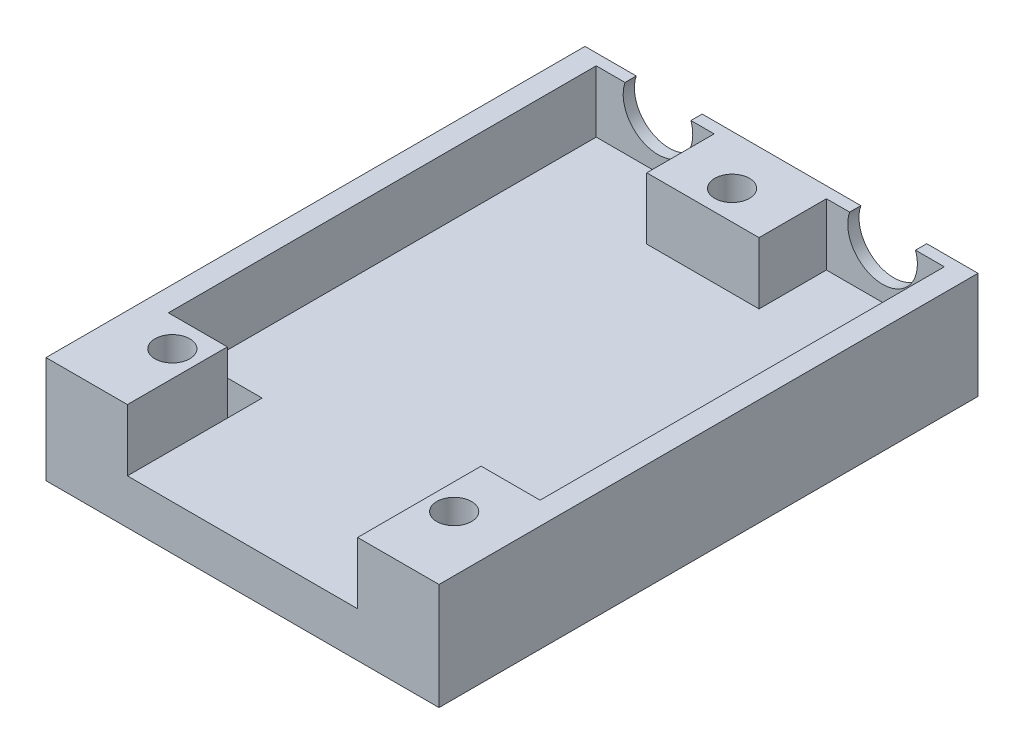
ISO-10303-21;
HEADER;
FILE_DESCRIPTION(('STEP AP214'),'2;1');
FILE_NAME('part.step','',(''),(''),'','','');
FILE_SCHEMA(('AUTOMOTIVE_DESIGN { 1 0 10303 214 1 1 1 1 }'));
ENDSEC;
DATA;
#1=APPLICATION_CONTEXT('core data for automotive mechanical design processes');
#2=APPLICATION_PROTOCOL_DEFINITION('international standard','automotive_design',2000,#1);
#3=PRODUCT_CONTEXT('',#1,'mechanical');
#4=PRODUCT('Part','Part','',(#3));
#5=PRODUCT_RELATED_PRODUCT_CATEGORY('part','',(#4));
#6=PRODUCT_DEFINITION_FORMATION('','',#4);
#7=PRODUCT_DEFINITION_CONTEXT('part definition',#1,'design');
#8=PRODUCT_DEFINITION('design','',#6,#7);
#9=PRODUCT_DEFINITION_SHAPE('','',#8);
#10=(LENGTH_UNIT() NAMED_UNIT(*) SI_UNIT(.MILLI.,.METRE.));
#11=(NAMED_UNIT(*) PLANE_ANGLE_UNIT() SI_UNIT($,.RADIAN.));
#12=(NAMED_UNIT(*) SI_UNIT($,.STERADIAN.) SOLID_ANGLE_UNIT());
#13=UNCERTAINTY_MEASURE_WITH_UNIT(LENGTH_MEASURE(1.E-05),#10,'distance_accuracy_value','');
#14=(GEOMETRIC_REPRESENTATION_CONTEXT(3) GLOBAL_UNCERTAINTY_ASSIGNED_CONTEXT((#13)) GLOBAL_UNIT_ASSIGNED_CONTEXT((#10,
#11,#12)) REPRESENTATION_CONTEXT('',''));
#15=CARTESIAN_POINT('',(0.,0.,0.));
#16=DIRECTION('',(0.,0.,1.));
#17=DIRECTION('',(1.,0.,0.));
#18=AXIS2_PLACEMENT_3D('',#15,#16,#17);
#19=CARTESIAN_POINT('',(0.,9.5,-23.));
#20=DIRECTION('',(0.,0.,-1.));
#21=DIRECTION('',(-1.,0.,0.));
#22=AXIS2_PLACEMENT_3D('',#19,#20,#21);
#23=PLANE('',#22);
#24=CARTESIAN_POINT('',(-10.,8.5,-23.));
#25=DIRECTION('',(0.,0.,-1.));
#26=DIRECTION('',(-1.,0.,0.));
#27=AXIS2_PLACEMENT_3D('',#24,#25,#26);
#28=CIRCLE('',#27,3.1);
#29=CARTESIAN_POINT('',(-12.9342801502242,9.5,-23.));
#30=VERTEX_POINT('',#29);
#31=CARTESIAN_POINT('',(-7.06571984977576,9.5,-23.));
#32=VERTEX_POINT('',#31);
#33=EDGE_CURVE('E355',#30,#32,#28,.F.);
#34=ORIENTED_EDGE('',*,*,#33,.F.);
#35=DIRECTION('',(1.,0.,0.));
#36=VECTOR('',#35,1.);
#37=CARTESIAN_POINT('',(0.,9.5,-23.));
#38=LINE('',#37,#36);
#39=CARTESIAN_POINT('',(-15.5,9.5,-23.));
#40=VERTEX_POINT('',#39);
#41=EDGE_CURVE('E432',#40,#30,#38,.T.);
#42=ORIENTED_EDGE('',*,*,#41,.F.);
#43=DIRECTION('',(0.,-1.,0.));
#44=VECTOR('',#43,1.);
#45=CARTESIAN_POINT('',(-15.5,9.5,-23.));
#46=LINE('',#45,#44);
#47=CARTESIAN_POINT('',(-15.5,4.,-23.));
#48=VERTEX_POINT('',#47);
#49=EDGE_CURVE('E442',#40,#48,#46,.T.);
#50=ORIENTED_EDGE('',*,*,#49,.T.);
#51=DIRECTION('',(1.,0.,0.));
#52=VECTOR('',#51,1.);
#53=CARTESIAN_POINT('',(0.,4.,-23.));
#54=LINE('',#53,#52);
#55=CARTESIAN_POINT('',(-4.99999999999998,4.,-23.));
#56=VERTEX_POINT('',#55);
#57=EDGE_CURVE('E443',#48,#56,#54,.T.);
#58=ORIENTED_EDGE('',*,*,#57,.T.);
#59=DIRECTION('',(0.,-1.,0.));
#60=VECTOR('',#59,1.);
#61=CARTESIAN_POINT('',(-4.99999999999998,9.5,-23.));
#62=LINE('',#61,#60);
#63=CARTESIAN_POINT('',(-4.99999999999998,9.5,-23.));
#64=VERTEX_POINT('',#63);
#65=EDGE_CURVE('E400',#64,#56,#62,.T.);
#66=ORIENTED_EDGE('',*,*,#65,.F.);
#67=EDGE_CURVE('E436',#32,#64,#38,.T.);
#68=ORIENTED_EDGE('',*,*,#67,.F.);
#69=EDGE_LOOP('',(#34,#42,#50,#58,#66,#68));
#70=FACE_BOUND('',#69,.T.);
#71=ADVANCED_FACE('F37',(#70),#23,.F.);
#72=CARTESIAN_POINT('',(10.,8.5,-23.));
#73=DIRECTION('',(0.,0.,-1.));
#74=DIRECTION('',(-1.,0.,0.));
#75=AXIS2_PLACEMENT_3D('',#72,#73,#74);
#76=CIRCLE('',#75,3.1);
#77=CARTESIAN_POINT('',(7.06571984977576,9.5,-23.));
#78=VERTEX_POINT('',#77);
#79=CARTESIAN_POINT('',(12.9342801502242,9.5,-23.));
#80=VERTEX_POINT('',#79);
#81=EDGE_CURVE('E359',#78,#80,#76,.F.);
#82=ORIENTED_EDGE('',*,*,#81,.F.);
#83=CARTESIAN_POINT('',(5.00000000000002,9.5,-23.));
#84=VERTEX_POINT('',#83);
#85=EDGE_CURVE('E437',#84,#78,#38,.T.);
#86=ORIENTED_EDGE('',*,*,#85,.F.);
#87=DIRECTION('',(0.,-1.,0.));
#88=VECTOR('',#87,1.);
#89=CARTESIAN_POINT('',(5.00000000000002,9.5,-23.));
#90=LINE('',#89,#88);
#91=CARTESIAN_POINT('',(5.00000000000002,4.,-23.));
#92=VERTEX_POINT('',#91);
#93=EDGE_CURVE('E408',#84,#92,#90,.T.);
#94=ORIENTED_EDGE('',*,*,#93,.T.);
#95=CARTESIAN_POINT('',(15.5,4.,-23.));
#96=VERTEX_POINT('',#95);
#97=EDGE_CURVE('E415',#92,#96,#54,.T.);
#98=ORIENTED_EDGE('',*,*,#97,.T.);
#99=DIRECTION('',(0.,-1.,0.));
#100=VECTOR('',#99,1.);
#101=CARTESIAN_POINT('',(15.5,9.5,-23.));
#102=LINE('',#101,#100);
#103=CARTESIAN_POINT('',(15.5,9.5,-23.));
#104=VERTEX_POINT('',#103);
#105=EDGE_CURVE('E454',#104,#96,#102,.T.);
#106=ORIENTED_EDGE('',*,*,#105,.F.);
#107=EDGE_CURVE('E431',#80,#104,#38,.T.);
#108=ORIENTED_EDGE('',*,*,#107,.F.);
#109=EDGE_LOOP('',(#82,#86,#94,#98,#106,#108));
#110=FACE_BOUND('',#109,.T.);
#111=ADVANCED_FACE('F582',(#110),#23,.F.);
#112=CARTESIAN_POINT('',(-17.5,4.,-24.));
#113=DIRECTION('',(0.,0.,1.));
#114=DIRECTION('',(1.,0.,0.));
#115=AXIS2_PLACEMENT_3D('',#112,#113,#114);
#116=PLANE('',#115);
#117=CARTESIAN_POINT('',(10.,8.5,-24.));
#118=DIRECTION('',(0.,0.,-1.));
#119=DIRECTION('',(-1.,0.,0.));
#120=AXIS2_PLACEMENT_3D('',#117,#118,#119);
#121=CIRCLE('',#120,3.1);
#122=CARTESIAN_POINT('',(7.06571984977576,9.5,-24.));
#123=VERTEX_POINT('',#122);
#124=CARTESIAN_POINT('',(12.9342801502242,9.5,-24.));
#125=VERTEX_POINT('',#124);
#126=EDGE_CURVE('E352',#123,#125,#121,.F.);
#127=ORIENTED_EDGE('',*,*,#126,.T.);
#128=DIRECTION('',(-1.,0.,0.));
#129=VECTOR('',#128,1.);
#130=CARTESIAN_POINT('',(0.,9.5,-24.));
#131=LINE('',#130,#129);
#132=CARTESIAN_POINT('',(17.5,9.5,-24.));
#133=VERTEX_POINT('',#132);
#134=EDGE_CURVE('E416',#133,#125,#131,.T.);
#135=ORIENTED_EDGE('',*,*,#134,.F.);
#136=DIRECTION('',(0.,-1.,0.));
#137=VECTOR('',#136,1.);
#138=CARTESIAN_POINT('',(17.5,4.,-24.));
#139=LINE('',#138,#137);
#140=CARTESIAN_POINT('',(17.5,0.,-24.));
#141=VERTEX_POINT('',#140);
#142=EDGE_CURVE('E469',#133,#141,#139,.T.);
#143=ORIENTED_EDGE('',*,*,#142,.T.);
#144=DIRECTION('',(-1.,0.,0.));
#145=VECTOR('',#144,1.);
#146=CARTESIAN_POINT('',(-17.5,0.,-24.));
#147=LINE('',#146,#145);
#148=CARTESIAN_POINT('',(-17.5,0.,-24.));
#149=VERTEX_POINT('',#148);
#150=EDGE_CURVE('E464',#141,#149,#147,.T.);
#151=ORIENTED_EDGE('',*,*,#150,.T.);
#152=DIRECTION('',(0.,-1.,0.));
#153=VECTOR('',#152,1.);
#154=CARTESIAN_POINT('',(-17.5,4.,-24.));
#155=LINE('',#154,#153);
#156=CARTESIAN_POINT('',(-17.5,9.5,-24.));
#157=VERTEX_POINT('',#156);
#158=EDGE_CURVE('E466',#157,#149,#155,.T.);
#159=ORIENTED_EDGE('',*,*,#158,.F.);
#160=CARTESIAN_POINT('',(-12.9342801502242,9.5,-24.));
#161=VERTEX_POINT('',#160);
#162=EDGE_CURVE('E421',#161,#157,#131,.T.);
#163=ORIENTED_EDGE('',*,*,#162,.F.);
#164=CARTESIAN_POINT('',(-10.,8.5,-24.));
#165=DIRECTION('',(0.,0.,-1.));
#166=DIRECTION('',(-1.,0.,0.));
#167=AXIS2_PLACEMENT_3D('',#164,#165,#166);
#168=CIRCLE('',#167,3.1);
#169=CARTESIAN_POINT('',(-7.06571984977576,9.5,-24.));
#170=VERTEX_POINT('',#169);
#171=EDGE_CURVE('E351',#161,#170,#168,.F.);
#172=ORIENTED_EDGE('',*,*,#171,.T.);
#173=EDGE_CURVE('E420',#123,#170,#131,.T.);
#174=ORIENTED_EDGE('',*,*,#173,.F.);
#175=EDGE_LOOP('',(#127,#135,#143,#151,#159,#163,#172,#174));
#176=FACE_BOUND('',#175,.T.);
#177=ADVANCED_FACE('F493',(#176),#116,.F.);
#178=CARTESIAN_POINT('',(0.,9.5,0.));
#179=DIRECTION('',(0.,1.,0.));
#180=DIRECTION('',(0.,0.,1.));
#181=AXIS2_PLACEMENT_3D('',#178,#179,#180);
#182=PLANE('',#181);
#183=CARTESIAN_POINT('',(12.55,9.5,17.7));
#184=DIRECTION('',(0.,1.,0.));
#185=DIRECTION('',(0.,0.,1.));
#186=AXIS2_PLACEMENT_3D('',#183,#184,#185);
#187=CIRCLE('',#186,1.55);
#188=CARTESIAN_POINT('',(12.55,9.5,19.25));
#189=VERTEX_POINT('',#188);
#190=EDGE_CURVE('E316',#189,#189,#187,.T.);
#191=ORIENTED_EDGE('',*,*,#190,.F.);
#192=EDGE_LOOP('',(#191));
#193=FACE_BOUND('',#192,.T.);
#194=ORIENTED_EDGE('',*,*,#134,.T.);
#195=DIRECTION('',(0.,0.,-1.));
#196=VECTOR('',#195,1.);
#197=CARTESIAN_POINT('',(12.9342801502242,9.5,-22.));
#198=LINE('',#197,#196);
#199=EDGE_CURVE('E11',#125,#80,#198,.F.);
#200=ORIENTED_EDGE('',*,*,#199,.T.);
#201=ORIENTED_EDGE('',*,*,#107,.T.);
#202=DIRECTION('',(0.,0.,1.));
#203=VECTOR('',#202,1.);
#204=CARTESIAN_POINT('',(15.5,9.5,0.));
#205=LINE('',#204,#203);
#206=CARTESIAN_POINT('',(15.5,9.5,13.));
#207=VERTEX_POINT('',#206);
#208=EDGE_CURVE('E435',#104,#207,#205,.T.);
#209=ORIENTED_EDGE('',*,*,#208,.T.);
#210=DIRECTION('',(-1.,0.,0.));
#211=VECTOR('',#210,1.);
#212=CARTESIAN_POINT('',(15.5,9.5,13.));
#213=LINE('',#212,#211);
#214=CARTESIAN_POINT('',(10.25,9.5,13.));
#215=VERTEX_POINT('',#214);
#216=EDGE_CURVE('E371',#207,#215,#213,.T.);
#217=ORIENTED_EDGE('',*,*,#216,.T.);
#218=DIRECTION('',(0.,0.,1.));
#219=VECTOR('',#218,1.);
#220=CARTESIAN_POINT('',(10.25,9.5,21.));
#221=LINE('',#220,#219);
#222=CARTESIAN_POINT('',(10.25,9.5,24.));
#223=VERTEX_POINT('',#222);
#224=EDGE_CURVE('E373',#215,#223,#221,.T.);
#225=ORIENTED_EDGE('',*,*,#224,.T.);
#226=DIRECTION('',(1.,0.,0.));
#227=VECTOR('',#226,1.);
#228=CARTESIAN_POINT('',(0.,9.5,24.));
#229=LINE('',#228,#227);
#230=CARTESIAN_POINT('',(17.5,9.5,24.));
#231=VERTEX_POINT('',#230);
#232=EDGE_CURVE('E424',#223,#231,#229,.T.);
#233=ORIENTED_EDGE('',*,*,#232,.T.);
#234=DIRECTION('',(0.,0.,-1.));
#235=VECTOR('',#234,1.);
#236=CARTESIAN_POINT('',(17.5,9.5,0.));
#237=LINE('',#236,#235);
#238=EDGE_CURVE('E428',#231,#133,#237,.T.);
#239=ORIENTED_EDGE('',*,*,#238,.T.);
#240=EDGE_LOOP('',(#194,#200,#201,#209,#217,#225,#233,#239));
#241=FACE_BOUND('',#240,.T.);
#242=ADVANCED_FACE('F547',(#193,#241),#182,.T.);
#243=CARTESIAN_POINT('',(0.,9.5,-19.6));
#244=DIRECTION('',(0.,1.,0.));
#245=DIRECTION('',(0.,0.,1.));
#246=AXIS2_PLACEMENT_3D('',#243,#244,#245);
#247=CIRCLE('',#246,1.55);
#248=CARTESIAN_POINT('',(0.,9.5,-18.05));
#249=VERTEX_POINT('',#248);
#250=EDGE_CURVE('E273',#249,#249,#247,.T.);
#251=ORIENTED_EDGE('',*,*,#250,.F.);
#252=EDGE_LOOP('',(#251));
#253=FACE_BOUND('',#252,.T.);
#254=ORIENTED_EDGE('',*,*,#85,.T.);
#255=DIRECTION('',(0.,0.,-1.));
#256=VECTOR('',#255,1.);
#257=CARTESIAN_POINT('',(7.06571984977576,9.5,-22.));
#258=LINE('',#257,#256);
#259=EDGE_CURVE('E45',#78,#123,#258,.T.);
#260=ORIENTED_EDGE('',*,*,#259,.T.);
#261=ORIENTED_EDGE('',*,*,#173,.T.);
#262=DIRECTION('',(0.,0.,-1.));
#263=VECTOR('',#262,1.);
#264=CARTESIAN_POINT('',(-7.06571984977576,9.5,-22.));
#265=LINE('',#264,#263);
#266=EDGE_CURVE('E481',#170,#32,#265,.F.);
#267=ORIENTED_EDGE('',*,*,#266,.T.);
#268=ORIENTED_EDGE('',*,*,#67,.T.);
#269=DIRECTION('',(0.,0.,1.));
#270=VECTOR('',#269,1.);
#271=CARTESIAN_POINT('',(-4.99999999999998,9.5,-23.));
#272=LINE('',#271,#270);
#273=CARTESIAN_POINT('',(-4.99999999999998,9.5,-17.));
#274=VERTEX_POINT('',#273);
#275=EDGE_CURVE('E392',#64,#274,#272,.T.);
#276=ORIENTED_EDGE('',*,*,#275,.T.);
#277=DIRECTION('',(1.,0.,0.));
#278=VECTOR('',#277,1.);
#279=CARTESIAN_POINT('',(-4.99999999999998,9.5,-17.));
#280=LINE('',#279,#278);
#281=CARTESIAN_POINT('',(5.00000000000002,9.5,-17.));
#282=VERTEX_POINT('',#281);
#283=EDGE_CURVE('E395',#274,#282,#280,.T.);
#284=ORIENTED_EDGE('',*,*,#283,.T.);
#285=DIRECTION('',(0.,0.,-1.));
#286=VECTOR('',#285,1.);
#287=CARTESIAN_POINT('',(5.00000000000002,9.5,-23.));
#288=LINE('',#287,#286);
#289=EDGE_CURVE('E398',#282,#84,#288,.T.);
#290=ORIENTED_EDGE('',*,*,#289,.T.);
#291=EDGE_LOOP('',(#254,#260,#261,#267,#268,#276,#284,#290));
#292=FACE_BOUND('',#291,.T.);
#293=ADVANCED_FACE('F488',(#253,#292),#182,.T.);
#294=CARTESIAN_POINT('',(-12.55,9.5,17.7));
#295=DIRECTION('',(0.,1.,0.));
#296=DIRECTION('',(0.,0.,1.));
#297=AXIS2_PLACEMENT_3D('',#294,#295,#296);
#298=CIRCLE('',#297,1.55);
#299=CARTESIAN_POINT('',(-12.55,9.5,19.25));
#300=VERTEX_POINT('',#299);
#301=EDGE_CURVE('E310',#300,#300,#298,.T.);
#302=ORIENTED_EDGE('',*,*,#301,.F.);
#303=EDGE_LOOP('',(#302));
#304=FACE_BOUND('',#303,.T.);
#305=DIRECTION('',(1.,0.,0.));
#306=VECTOR('',#305,1.);
#307=CARTESIAN_POINT('',(-15.5,9.5,15.1));
#308=LINE('',#307,#306);
#309=CARTESIAN_POINT('',(-15.5,9.5,15.1));
#310=VERTEX_POINT('',#309);
#311=CARTESIAN_POINT('',(-10.25,9.5,15.1));
#312=VERTEX_POINT('',#311);
#313=EDGE_CURVE('E309',#310,#312,#308,.T.);
#314=ORIENTED_EDGE('',*,*,#313,.F.);
#315=DIRECTION('',(0.,0.,1.));
#316=VECTOR('',#315,1.);
#317=CARTESIAN_POINT('',(-15.5,9.5,0.));
#318=LINE('',#317,#316);
#319=EDGE_CURVE('E440',#40,#310,#318,.T.);
#320=ORIENTED_EDGE('',*,*,#319,.F.);
#321=ORIENTED_EDGE('',*,*,#41,.T.);
#322=DIRECTION('',(0.,0.,-1.));
#323=VECTOR('',#322,1.);
#324=CARTESIAN_POINT('',(-12.9342801502242,9.5,-22.));
#325=LINE('',#324,#323);
#326=EDGE_CURVE('E478',#30,#161,#325,.T.);
#327=ORIENTED_EDGE('',*,*,#326,.T.);
#328=ORIENTED_EDGE('',*,*,#162,.T.);
#329=DIRECTION('',(0.,0.,1.));
#330=VECTOR('',#329,1.);
#331=CARTESIAN_POINT('',(-17.5,9.5,0.));
#332=LINE('',#331,#330);
#333=CARTESIAN_POINT('',(-17.5,9.5,24.));
#334=VERTEX_POINT('',#333);
#335=EDGE_CURVE('E419',#157,#334,#332,.T.);
#336=ORIENTED_EDGE('',*,*,#335,.T.);
#337=CARTESIAN_POINT('',(-10.25,9.5,24.));
#338=VERTEX_POINT('',#337);
#339=EDGE_CURVE('E425',#334,#338,#229,.T.);
#340=ORIENTED_EDGE('',*,*,#339,.T.);
#341=DIRECTION('',(0.,0.,-1.));
#342=VECTOR('',#341,1.);
#343=CARTESIAN_POINT('',(-10.25,9.5,21.));
#344=LINE('',#343,#342);
#345=EDGE_CURVE('E386',#338,#312,#344,.T.);
#346=ORIENTED_EDGE('',*,*,#345,.T.);
#347=EDGE_LOOP('',(#314,#320,#321,#327,#328,#336,#340,#346));
#348=FACE_BOUND('',#347,.T.);
#349=ADVANCED_FACE('F499',(#304,#348),#182,.T.);
#350=CARTESIAN_POINT('',(0.,4.,0.));
#351=DIRECTION('',(0.,1.,0.));
#352=DIRECTION('',(0.,0.,1.));
#353=AXIS2_PLACEMENT_3D('',#350,#351,#352);
#354=PLANE('',#353);
#355=DIRECTION('',(-1.,0.,0.));
#356=VECTOR('',#355,1.);
#357=CARTESIAN_POINT('',(0.,4.,12.));
#358=LINE('',#357,#356);
#359=CARTESIAN_POINT('',(-10.25,4.,12.));
#360=VERTEX_POINT('',#359);
#361=CARTESIAN_POINT('',(-15.5,4.,12.));
#362=VERTEX_POINT('',#361);
#363=EDGE_CURVE('E349',#360,#362,#358,.T.);
#364=ORIENTED_EDGE('',*,*,#363,.F.);
#365=DIRECTION('',(0.,0.,-1.));
#366=VECTOR('',#365,1.);
#367=CARTESIAN_POINT('',(-10.25,4.,0.));
#368=LINE('',#367,#366);
#369=CARTESIAN_POINT('',(-10.25,4.,15.1));
#370=VERTEX_POINT('',#369);
#371=EDGE_CURVE('E347',#370,#360,#368,.T.);
#372=ORIENTED_EDGE('',*,*,#371,.F.);
#373=DIRECTION('',(0.,0.,-1.));
#374=VECTOR('',#373,1.);
#375=CARTESIAN_POINT('',(-10.25,4.,21.));
#376=LINE('',#375,#374);
#377=CARTESIAN_POINT('',(-10.25,4.,24.));
#378=VERTEX_POINT('',#377);
#379=EDGE_CURVE('E385',#378,#370,#376,.T.);
#380=ORIENTED_EDGE('',*,*,#379,.F.);
#381=DIRECTION('',(1.,0.,0.));
#382=VECTOR('',#381,1.);
#383=CARTESIAN_POINT('',(-10.25,4.,24.));
#384=LINE('',#383,#382);
#385=CARTESIAN_POINT('',(10.25,4.,24.));
#386=VERTEX_POINT('',#385);
#387=EDGE_CURVE('E366',#378,#386,#384,.T.);
#388=ORIENTED_EDGE('',*,*,#387,.T.);
#389=DIRECTION('',(0.,0.,1.));
#390=VECTOR('',#389,1.);
#391=CARTESIAN_POINT('',(10.25,4.,21.));
#392=LINE('',#391,#390);
#393=CARTESIAN_POINT('',(10.25,4.,13.));
#394=VERTEX_POINT('',#393);
#395=EDGE_CURVE('E374',#394,#386,#392,.T.);
#396=ORIENTED_EDGE('',*,*,#395,.F.);
#397=DIRECTION('',(-1.,0.,0.));
#398=VECTOR('',#397,1.);
#399=CARTESIAN_POINT('',(15.5,4.,13.));
#400=LINE('',#399,#398);
#401=CARTESIAN_POINT('',(15.5,4.,13.));
#402=VERTEX_POINT('',#401);
#403=EDGE_CURVE('E365',#402,#394,#400,.T.);
#404=ORIENTED_EDGE('',*,*,#403,.F.);
#405=DIRECTION('',(0.,0.,1.));
#406=VECTOR('',#405,1.);
#407=CARTESIAN_POINT('',(15.5,4.,0.));
#408=LINE('',#407,#406);
#409=EDGE_CURVE('E446',#96,#402,#408,.T.);
#410=ORIENTED_EDGE('',*,*,#409,.F.);
#411=ORIENTED_EDGE('',*,*,#97,.F.);
#412=DIRECTION('',(0.,0.,-1.));
#413=VECTOR('',#412,1.);
#414=CARTESIAN_POINT('',(5.00000000000002,4.,-23.));
#415=LINE('',#414,#413);
#416=CARTESIAN_POINT('',(5.00000000000002,4.,-17.));
#417=VERTEX_POINT('',#416);
#418=EDGE_CURVE('E396',#417,#92,#415,.T.);
#419=ORIENTED_EDGE('',*,*,#418,.F.);
#420=DIRECTION('',(1.,0.,0.));
#421=VECTOR('',#420,1.);
#422=CARTESIAN_POINT('',(-4.99999999999998,4.,-17.));
#423=LINE('',#422,#421);
#424=CARTESIAN_POINT('',(-4.99999999999998,4.,-17.));
#425=VERTEX_POINT('',#424);
#426=EDGE_CURVE('E403',#425,#417,#423,.T.);
#427=ORIENTED_EDGE('',*,*,#426,.F.);
#428=DIRECTION('',(0.,0.,1.));
#429=VECTOR('',#428,1.);
#430=CARTESIAN_POINT('',(-4.99999999999998,4.,-23.));
#431=LINE('',#430,#429);
#432=EDGE_CURVE('E389',#56,#425,#431,.T.);
#433=ORIENTED_EDGE('',*,*,#432,.F.);
#434=ORIENTED_EDGE('',*,*,#57,.F.);
#435=DIRECTION('',(0.,0.,1.));
#436=VECTOR('',#435,1.);
#437=CARTESIAN_POINT('',(-15.5,4.,0.));
#438=LINE('',#437,#436);
#439=EDGE_CURVE('E449',#48,#362,#438,.T.);
#440=ORIENTED_EDGE('',*,*,#439,.T.);
#441=EDGE_LOOP('',(#364,#372,#380,#388,#396,#404,#410,#411,#419,#427,#433,#434,#440));
#442=FACE_BOUND('',#441,.T.);
#443=ADVANCED_FACE('F525',(#442),#354,.T.);
#444=CARTESIAN_POINT('',(15.5,9.5,0.));
#445=DIRECTION('',(1.,0.,0.));
#446=DIRECTION('',(0.,0.,-1.));
#447=AXIS2_PLACEMENT_3D('',#444,#445,#446);
#448=PLANE('',#447);
#449=DIRECTION('',(0.,-1.,0.));
#450=VECTOR('',#449,1.);
#451=CARTESIAN_POINT('',(15.5,9.5,13.));
#452=LINE('',#451,#450);
#453=EDGE_CURVE('E382',#207,#402,#452,.T.);
#454=ORIENTED_EDGE('',*,*,#453,.F.);
#455=ORIENTED_EDGE('',*,*,#208,.F.);
#456=ORIENTED_EDGE('',*,*,#105,.T.);
#457=ORIENTED_EDGE('',*,*,#409,.T.);
#458=EDGE_LOOP('',(#454,#455,#456,#457));
#459=FACE_BOUND('',#458,.T.);
#460=ADVANCED_FACE('F560',(#459),#448,.F.);
#461=CARTESIAN_POINT('',(-15.5,9.5,0.));
#462=DIRECTION('',(1.,0.,0.));
#463=DIRECTION('',(0.,0.,-1.));
#464=AXIS2_PLACEMENT_3D('',#461,#462,#463);
#465=PLANE('',#464);
#466=ORIENTED_EDGE('',*,*,#319,.T.);
#467=DIRECTION('',(0.,1.,0.));
#468=VECTOR('',#467,1.);
#469=CARTESIAN_POINT('',(-15.5,-6.09692545468616,15.1));
#470=LINE('',#469,#468);
#471=CARTESIAN_POINT('',(-15.5,0.,15.1));
#472=VERTEX_POINT('',#471);
#473=EDGE_CURVE('E334',#472,#310,#470,.T.);
#474=ORIENTED_EDGE('',*,*,#473,.F.);
#475=DIRECTION('',(0.,0.,-1.));
#476=VECTOR('',#475,1.);
#477=CARTESIAN_POINT('',(-15.5,0.,12.));
#478=LINE('',#477,#476);
#479=CARTESIAN_POINT('',(-15.5,0.,12.));
#480=VERTEX_POINT('',#479);
#481=EDGE_CURVE('E330',#472,#480,#478,.T.);
#482=ORIENTED_EDGE('',*,*,#481,.T.);
#483=DIRECTION('',(0.,1.,0.));
#484=VECTOR('',#483,1.);
#485=CARTESIAN_POINT('',(-15.5,-6.09692545468616,12.));
#486=LINE('',#485,#484);
#487=EDGE_CURVE('E328',#480,#362,#486,.T.);
#488=ORIENTED_EDGE('',*,*,#487,.T.);
#489=ORIENTED_EDGE('',*,*,#439,.F.);
#490=ORIENTED_EDGE('',*,*,#49,.F.);
#491=EDGE_LOOP('',(#466,#474,#482,#488,#489,#490));
#492=FACE_BOUND('',#491,.T.);
#493=ADVANCED_FACE('F532',(#492),#465,.T.);
#494=CARTESIAN_POINT('',(-17.5,4.,-24.));
#495=DIRECTION('',(1.,0.,0.));
#496=DIRECTION('',(0.,0.,-1.));
#497=AXIS2_PLACEMENT_3D('',#494,#495,#496);
#498=PLANE('',#497);
#499=DIRECTION('',(0.,0.,1.));
#500=VECTOR('',#499,1.);
#501=CARTESIAN_POINT('',(-17.5,0.,-24.));
#502=LINE('',#501,#500);
#503=CARTESIAN_POINT('',(-17.5,0.,24.));
#504=VERTEX_POINT('',#503);
#505=EDGE_CURVE('E457',#149,#504,#502,.T.);
#506=ORIENTED_EDGE('',*,*,#505,.T.);
#507=DIRECTION('',(0.,-1.,0.));
#508=VECTOR('',#507,1.);
#509=CARTESIAN_POINT('',(-17.5,4.,24.));
#510=LINE('',#509,#508);
#511=EDGE_CURVE('E475',#334,#504,#510,.T.);
#512=ORIENTED_EDGE('',*,*,#511,.F.);
#513=ORIENTED_EDGE('',*,*,#335,.F.);
#514=ORIENTED_EDGE('',*,*,#158,.T.);
#515=EDGE_LOOP('',(#506,#512,#513,#514));
#516=FACE_BOUND('',#515,.T.);
#517=ADVANCED_FACE('F39',(#516),#498,.F.);
#518=CARTESIAN_POINT('',(-17.5,4.,24.));
#519=DIRECTION('',(0.,0.,-1.));
#520=DIRECTION('',(-1.,0.,0.));
#521=AXIS2_PLACEMENT_3D('',#518,#519,#520);
#522=PLANE('',#521);
#523=ORIENTED_EDGE('',*,*,#232,.F.);
#524=DIRECTION('',(0.,1.,0.));
#525=VECTOR('',#524,1.);
#526=CARTESIAN_POINT('',(10.25,9.5,24.));
#527=LINE('',#526,#525);
#528=EDGE_CURVE('E362',#386,#223,#527,.T.);
#529=ORIENTED_EDGE('',*,*,#528,.F.);
#530=ORIENTED_EDGE('',*,*,#387,.F.);
#531=DIRECTION('',(0.,-1.,0.));
#532=VECTOR('',#531,1.);
#533=CARTESIAN_POINT('',(-10.25,9.5,24.));
#534=LINE('',#533,#532);
#535=EDGE_CURVE('E361',#338,#378,#534,.T.);
#536=ORIENTED_EDGE('',*,*,#535,.F.);
#537=ORIENTED_EDGE('',*,*,#339,.F.);
#538=ORIENTED_EDGE('',*,*,#511,.T.);
#539=DIRECTION('',(1.,0.,0.));
#540=VECTOR('',#539,1.);
#541=CARTESIAN_POINT('',(-17.5,0.,24.));
#542=LINE('',#541,#540);
#543=CARTESIAN_POINT('',(17.5,0.,24.));
#544=VERTEX_POINT('',#543);
#545=EDGE_CURVE('E460',#504,#544,#542,.T.);
#546=ORIENTED_EDGE('',*,*,#545,.T.);
#547=DIRECTION('',(0.,-1.,0.));
#548=VECTOR('',#547,1.);
#549=CARTESIAN_POINT('',(17.5,4.,24.));
#550=LINE('',#549,#548);
#551=EDGE_CURVE('E472',#231,#544,#550,.T.);
#552=ORIENTED_EDGE('',*,*,#551,.F.);
#553=EDGE_LOOP('',(#523,#529,#530,#536,#537,#538,#546,#552));
#554=FACE_BOUND('',#553,.T.);
#555=ADVANCED_FACE('F507',(#554),#522,.F.);
#556=CARTESIAN_POINT('',(17.5,4.,-24.));
#557=DIRECTION('',(-1.,0.,0.));
#558=DIRECTION('',(0.,0.,1.));
#559=AXIS2_PLACEMENT_3D('',#556,#557,#558);
#560=PLANE('',#559);
#561=DIRECTION('',(0.,0.,-1.));
#562=VECTOR('',#561,1.);
#563=CARTESIAN_POINT('',(17.5,0.,-24.));
#564=LINE('',#563,#562);
#565=EDGE_CURVE('E462',#544,#141,#564,.T.);
#566=ORIENTED_EDGE('',*,*,#565,.T.);
#567=ORIENTED_EDGE('',*,*,#142,.F.);
#568=ORIENTED_EDGE('',*,*,#238,.F.);
#569=ORIENTED_EDGE('',*,*,#551,.T.);
#570=EDGE_LOOP('',(#566,#567,#568,#569));
#571=FACE_BOUND('',#570,.T.);
#572=ADVANCED_FACE('F540',(#571),#560,.F.);
#573=CARTESIAN_POINT('',(0.,0.,0.));
#574=DIRECTION('',(0.,1.,0.));
#575=DIRECTION('',(0.,0.,1.));
#576=AXIS2_PLACEMENT_3D('',#573,#574,#575);
#577=PLANE('',#576);
#578=DIRECTION('',(1.,0.,0.));
#579=VECTOR('',#578,1.);
#580=CARTESIAN_POINT('',(-2.54999999999999,0.,3.6));
#581=LINE('',#580,#579);
#582=CARTESIAN_POINT('',(-2.54999999999999,0.,3.6));
#583=VERTEX_POINT('',#582);
#584=CARTESIAN_POINT('',(2.45000000000001,0.,3.6));
#585=VERTEX_POINT('',#584);
#586=EDGE_CURVE('E266',#583,#585,#581,.T.);
#587=ORIENTED_EDGE('',*,*,#586,.F.);
#588=DIRECTION('',(0.,0.,-1.));
#589=VECTOR('',#588,1.);
#590=CARTESIAN_POINT('',(-2.54999999999999,0.,8.6));
#591=LINE('',#590,#589);
#592=CARTESIAN_POINT('',(-2.54999999999999,0.,8.6));
#593=VERTEX_POINT('',#592);
#594=EDGE_CURVE('E52',#593,#583,#591,.T.);
#595=ORIENTED_EDGE('',*,*,#594,.F.);
#596=DIRECTION('',(-1.,0.,0.));
#597=VECTOR('',#596,1.);
#598=CARTESIAN_POINT('',(-2.54999999999999,0.,8.6));
#599=LINE('',#598,#597);
#600=CARTESIAN_POINT('',(2.45000000000001,0.,8.6));
#601=VERTEX_POINT('',#600);
#602=EDGE_CURVE('E257',#601,#593,#599,.T.);
#603=ORIENTED_EDGE('',*,*,#602,.F.);
#604=DIRECTION('',(0.,0.,1.));
#605=VECTOR('',#604,1.);
#606=CARTESIAN_POINT('',(2.45000000000001,0.,8.6));
#607=LINE('',#606,#605);
#608=EDGE_CURVE('E260',#585,#601,#607,.T.);
#609=ORIENTED_EDGE('',*,*,#608,.F.);
#610=EDGE_LOOP('',(#587,#595,#603,#609));
#611=FACE_BOUND('',#610,.T.);
#612=DIRECTION('',(1.,0.,0.));
#613=VECTOR('',#612,1.);
#614=CARTESIAN_POINT('',(-2.54999999999999,0.,-8.6));
#615=LINE('',#614,#613);
#616=CARTESIAN_POINT('',(-2.54999999999999,0.,-8.6));
#617=VERTEX_POINT('',#616);
#618=CARTESIAN_POINT('',(2.45000000000001,0.,-8.6));
#619=VERTEX_POINT('',#618);
#620=EDGE_CURVE('E292',#617,#619,#615,.T.);
#621=ORIENTED_EDGE('',*,*,#620,.F.);
#622=DIRECTION('',(0.,0.,-1.));
#623=VECTOR('',#622,1.);
#624=CARTESIAN_POINT('',(-2.54999999999999,0.,-3.6));
#625=LINE('',#624,#623);
#626=CARTESIAN_POINT('',(-2.54999999999999,0.,-3.6));
#627=VERTEX_POINT('',#626);
#628=EDGE_CURVE('E60',#627,#617,#625,.T.);
#629=ORIENTED_EDGE('',*,*,#628,.F.);
#630=DIRECTION('',(-1.,0.,0.));
#631=VECTOR('',#630,1.);
#632=CARTESIAN_POINT('',(-2.54999999999999,0.,-3.6));
#633=LINE('',#632,#631);
#634=CARTESIAN_POINT('',(2.45000000000001,0.,-3.6));
#635=VERTEX_POINT('',#634);
#636=EDGE_CURVE('E281',#635,#627,#633,.T.);
#637=ORIENTED_EDGE('',*,*,#636,.F.);
#638=DIRECTION('',(0.,0.,1.));
#639=VECTOR('',#638,1.);
#640=CARTESIAN_POINT('',(2.45000000000001,0.,-3.6));
#641=LINE('',#640,#639);
#642=EDGE_CURVE('E295',#619,#635,#641,.T.);
#643=ORIENTED_EDGE('',*,*,#642,.F.);
#644=EDGE_LOOP('',(#621,#629,#637,#643));
#645=FACE_BOUND('',#644,.T.);
#646=DIRECTION('',(1.,0.,0.));
#647=VECTOR('',#646,1.);
#648=CARTESIAN_POINT('',(-15.5,0.,12.));
#649=LINE('',#648,#647);
#650=CARTESIAN_POINT('',(-10.25,0.,12.));
#651=VERTEX_POINT('',#650);
#652=EDGE_CURVE('E327',#480,#651,#649,.T.);
#653=ORIENTED_EDGE('',*,*,#652,.F.);
#654=ORIENTED_EDGE('',*,*,#481,.F.);
#655=DIRECTION('',(-1.,0.,0.));
#656=VECTOR('',#655,1.);
#657=CARTESIAN_POINT('',(-15.5,0.,15.1));
#658=LINE('',#657,#656);
#659=CARTESIAN_POINT('',(-10.25,0.,15.1));
#660=VERTEX_POINT('',#659);
#661=EDGE_CURVE('E332',#660,#472,#658,.T.);
#662=ORIENTED_EDGE('',*,*,#661,.F.);
#663=DIRECTION('',(0.,0.,1.));
#664=VECTOR('',#663,1.);
#665=CARTESIAN_POINT('',(-10.25,0.,12.));
#666=LINE('',#665,#664);
#667=EDGE_CURVE('E324',#651,#660,#666,.T.);
#668=ORIENTED_EDGE('',*,*,#667,.F.);
#669=EDGE_LOOP('',(#653,#654,#662,#668));
#670=FACE_BOUND('',#669,.T.);
#671=ORIENTED_EDGE('',*,*,#505,.F.);
#672=ORIENTED_EDGE('',*,*,#150,.F.);
#673=ORIENTED_EDGE('',*,*,#565,.F.);
#674=ORIENTED_EDGE('',*,*,#545,.F.);
#675=EDGE_LOOP('',(#671,#672,#673,#674));
#676=FACE_BOUND('',#675,.T.);
#677=ADVANCED_FACE('F536',(#611,#645,#670,#676),#577,.F.);
#678=CARTESIAN_POINT('',(-4.99999999999998,9.5,-23.));
#679=DIRECTION('',(1.,0.,0.));
#680=DIRECTION('',(0.,0.,-1.));
#681=AXIS2_PLACEMENT_3D('',#678,#679,#680);
#682=PLANE('',#681);
#683=ORIENTED_EDGE('',*,*,#432,.T.);
#684=DIRECTION('',(0.,-1.,0.));
#685=VECTOR('',#684,1.);
#686=CARTESIAN_POINT('',(-4.99999999999998,9.5,-17.));
#687=LINE('',#686,#685);
#688=EDGE_CURVE('E413',#274,#425,#687,.T.);
#689=ORIENTED_EDGE('',*,*,#688,.F.);
#690=ORIENTED_EDGE('',*,*,#275,.F.);
#691=ORIENTED_EDGE('',*,*,#65,.T.);
#692=EDGE_LOOP('',(#683,#689,#690,#691));
#693=FACE_BOUND('',#692,.T.);
#694=ADVANCED_FACE('F539',(#693),#682,.F.);
#695=CARTESIAN_POINT('',(-4.99999999999998,9.5,-17.));
#696=DIRECTION('',(0.,0.,-1.));
#697=DIRECTION('',(-1.,0.,0.));
#698=AXIS2_PLACEMENT_3D('',#695,#696,#697);
#699=PLANE('',#698);
#700=ORIENTED_EDGE('',*,*,#426,.T.);
#701=DIRECTION('',(0.,-1.,0.));
#702=VECTOR('',#701,1.);
#703=CARTESIAN_POINT('',(5.00000000000002,9.5,-17.));
#704=LINE('',#703,#702);
#705=EDGE_CURVE('E411',#282,#417,#704,.T.);
#706=ORIENTED_EDGE('',*,*,#705,.F.);
#707=ORIENTED_EDGE('',*,*,#283,.F.);
#708=ORIENTED_EDGE('',*,*,#688,.T.);
#709=EDGE_LOOP('',(#700,#706,#707,#708));
#710=FACE_BOUND('',#709,.T.);
#711=ADVANCED_FACE('F577',(#710),#699,.F.);
#712=CARTESIAN_POINT('',(5.00000000000002,9.5,-23.));
#713=DIRECTION('',(-1.,0.,0.));
#714=DIRECTION('',(0.,0.,1.));
#715=AXIS2_PLACEMENT_3D('',#712,#713,#714);
#716=PLANE('',#715);
#717=ORIENTED_EDGE('',*,*,#418,.T.);
#718=ORIENTED_EDGE('',*,*,#93,.F.);
#719=ORIENTED_EDGE('',*,*,#289,.F.);
#720=ORIENTED_EDGE('',*,*,#705,.T.);
#721=EDGE_LOOP('',(#717,#718,#719,#720));
#722=FACE_BOUND('',#721,.T.);
#723=ADVANCED_FACE('F581',(#722),#716,.F.);
#724=CARTESIAN_POINT('',(-10.25,9.5,21.));
#725=DIRECTION('',(-1.,0.,0.));
#726=DIRECTION('',(0.,0.,1.));
#727=AXIS2_PLACEMENT_3D('',#724,#725,#726);
#728=PLANE('',#727);
#729=ORIENTED_EDGE('',*,*,#379,.T.);
#730=DIRECTION('',(0.,1.,0.));
#731=VECTOR('',#730,1.);
#732=CARTESIAN_POINT('',(-10.25,-6.09692545468616,15.1));
#733=LINE('',#732,#731);
#734=EDGE_CURVE('E343',#370,#312,#733,.T.);
#735=ORIENTED_EDGE('',*,*,#734,.T.);
#736=ORIENTED_EDGE('',*,*,#345,.F.);
#737=ORIENTED_EDGE('',*,*,#535,.T.);
#738=EDGE_LOOP('',(#729,#735,#736,#737));
#739=FACE_BOUND('',#738,.T.);
#740=ADVANCED_FACE('F514',(#739),#728,.F.);
#741=CARTESIAN_POINT('',(15.5,9.5,13.));
#742=DIRECTION('',(0.,0.,1.));
#743=DIRECTION('',(1.,0.,0.));
#744=AXIS2_PLACEMENT_3D('',#741,#742,#743);
#745=PLANE('',#744);
#746=ORIENTED_EDGE('',*,*,#403,.T.);
#747=DIRECTION('',(0.,-1.,0.));
#748=VECTOR('',#747,1.);
#749=CARTESIAN_POINT('',(10.25,9.5,13.));
#750=LINE('',#749,#748);
#751=EDGE_CURVE('E376',#215,#394,#750,.T.);
#752=ORIENTED_EDGE('',*,*,#751,.F.);
#753=ORIENTED_EDGE('',*,*,#216,.F.);
#754=ORIENTED_EDGE('',*,*,#453,.T.);
#755=EDGE_LOOP('',(#746,#752,#753,#754));
#756=FACE_BOUND('',#755,.T.);
#757=ADVANCED_FACE('F556',(#756),#745,.F.);
#758=CARTESIAN_POINT('',(10.25,9.5,21.));
#759=DIRECTION('',(1.,0.,0.));
#760=DIRECTION('',(0.,0.,-1.));
#761=AXIS2_PLACEMENT_3D('',#758,#759,#760);
#762=PLANE('',#761);
#763=ORIENTED_EDGE('',*,*,#395,.T.);
#764=ORIENTED_EDGE('',*,*,#528,.T.);
#765=ORIENTED_EDGE('',*,*,#224,.F.);
#766=ORIENTED_EDGE('',*,*,#751,.T.);
#767=EDGE_LOOP('',(#763,#764,#765,#766));
#768=FACE_BOUND('',#767,.T.);
#769=ADVANCED_FACE('F552',(#768),#762,.F.);
#770=CARTESIAN_POINT('',(-10.,8.5,-22.));
#771=DIRECTION('',(0.,0.,-1.));
#772=DIRECTION('',(-1.,0.,0.));
#773=AXIS2_PLACEMENT_3D('',#770,#771,#772);
#774=CYLINDRICAL_SURFACE('',#773,3.1);
#775=ORIENTED_EDGE('',*,*,#33,.T.);
#776=ORIENTED_EDGE('',*,*,#266,.F.);
#777=ORIENTED_EDGE('',*,*,#171,.F.);
#778=ORIENTED_EDGE('',*,*,#326,.F.);
#779=EDGE_LOOP('',(#775,#776,#777,#778));
#780=FACE_BOUND('',#779,.T.);
#781=ADVANCED_FACE('F585',(#780),#774,.F.);
#782=CARTESIAN_POINT('',(10.,8.5,-22.));
#783=DIRECTION('',(0.,0.,-1.));
#784=DIRECTION('',(-1.,0.,0.));
#785=AXIS2_PLACEMENT_3D('',#782,#783,#784);
#786=CYLINDRICAL_SURFACE('',#785,3.1);
#787=ORIENTED_EDGE('',*,*,#81,.T.);
#788=ORIENTED_EDGE('',*,*,#199,.F.);
#789=ORIENTED_EDGE('',*,*,#126,.F.);
#790=ORIENTED_EDGE('',*,*,#259,.F.);
#791=EDGE_LOOP('',(#787,#788,#789,#790));
#792=FACE_BOUND('',#791,.T.);
#793=ADVANCED_FACE('F583',(#792),#786,.F.);
#794=CARTESIAN_POINT('',(-15.5,-6.09692545468616,12.));
#795=DIRECTION('',(0.,0.,-1.));
#796=DIRECTION('',(-1.,0.,0.));
#797=AXIS2_PLACEMENT_3D('',#794,#795,#796);
#798=PLANE('',#797);
#799=ORIENTED_EDGE('',*,*,#363,.T.);
#800=ORIENTED_EDGE('',*,*,#487,.F.);
#801=ORIENTED_EDGE('',*,*,#652,.T.);
#802=DIRECTION('',(0.,1.,0.));
#803=VECTOR('',#802,1.);
#804=CARTESIAN_POINT('',(-10.25,-6.09692545468616,12.));
#805=LINE('',#804,#803);
#806=EDGE_CURVE('E337',#651,#360,#805,.T.);
#807=ORIENTED_EDGE('',*,*,#806,.T.);
#808=EDGE_LOOP('',(#799,#800,#801,#807));
#809=FACE_BOUND('',#808,.T.);
#810=ADVANCED_FACE('F529',(#809),#798,.F.);
#811=CARTESIAN_POINT('',(-10.25,-6.09692545468616,12.));
#812=DIRECTION('',(1.,0.,0.));
#813=DIRECTION('',(0.,0.,-1.));
#814=AXIS2_PLACEMENT_3D('',#811,#812,#813);
#815=PLANE('',#814);
#816=ORIENTED_EDGE('',*,*,#371,.T.);
#817=ORIENTED_EDGE('',*,*,#806,.F.);
#818=ORIENTED_EDGE('',*,*,#667,.T.);
#819=EDGE_CURVE('E340',#660,#370,#733,.T.);
#820=ORIENTED_EDGE('',*,*,#819,.T.);
#821=EDGE_LOOP('',(#816,#817,#818,#820));
#822=FACE_BOUND('',#821,.T.);
#823=ADVANCED_FACE('F519',(#822),#815,.F.);
#824=CARTESIAN_POINT('',(-15.5,-6.09692545468616,15.1));
#825=DIRECTION('',(0.,0.,1.));
#826=DIRECTION('',(1.,0.,0.));
#827=AXIS2_PLACEMENT_3D('',#824,#825,#826);
#828=PLANE('',#827);
#829=ORIENTED_EDGE('',*,*,#661,.T.);
#830=ORIENTED_EDGE('',*,*,#473,.T.);
#831=ORIENTED_EDGE('',*,*,#313,.T.);
#832=ORIENTED_EDGE('',*,*,#734,.F.);
#833=ORIENTED_EDGE('',*,*,#819,.F.);
#834=EDGE_LOOP('',(#829,#830,#831,#832,#833));
#835=FACE_BOUND('',#834,.T.);
#836=ADVANCED_FACE('F516',(#835),#828,.F.);
#837=CARTESIAN_POINT('',(-12.55,4.,17.7));
#838=DIRECTION('',(0.,1.,0.));
#839=DIRECTION('',(0.,0.,1.));
#840=AXIS2_PLACEMENT_3D('',#837,#838,#839);
#841=CYLINDRICAL_SURFACE('',#840,1.55);
#842=CARTESIAN_POINT('',(-12.55,4.,17.7));
#843=DIRECTION('',(0.,1.,0.));
#844=DIRECTION('',(0.,0.,1.));
#845=AXIS2_PLACEMENT_3D('',#842,#843,#844);
#846=CIRCLE('',#845,1.55);
#847=CARTESIAN_POINT('',(-12.55,4.,19.25));
#848=VERTEX_POINT('',#847);
#849=EDGE_CURVE('E306',#848,#848,#846,.T.);
#850=ORIENTED_EDGE('',*,*,#849,.F.);
#851=EDGE_LOOP('',(#850));
#852=FACE_BOUND('',#851,.T.);
#853=ORIENTED_EDGE('',*,*,#301,.T.);
#854=EDGE_LOOP('',(#853));
#855=FACE_BOUND('',#854,.T.);
#856=ADVANCED_FACE('F694',(#852,#855),#841,.F.);
#857=CARTESIAN_POINT('',(-12.55,4.,17.7));
#858=DIRECTION('',(0.,1.,0.));
#859=DIRECTION('',(0.,0.,1.));
#860=AXIS2_PLACEMENT_3D('',#857,#858,#859);
#861=PLANE('',#860);
#862=ORIENTED_EDGE('',*,*,#849,.T.);
#863=EDGE_LOOP('',(#862));
#864=FACE_BOUND('',#863,.T.);
#865=ADVANCED_FACE('F729',(#864),#861,.T.);
#866=CARTESIAN_POINT('',(0.,4.,-19.6));
#867=DIRECTION('',(0.,1.,0.));
#868=DIRECTION('',(0.,0.,1.));
#869=AXIS2_PLACEMENT_3D('',#866,#867,#868);
#870=CYLINDRICAL_SURFACE('',#869,1.55);
#871=CARTESIAN_POINT('',(0.,4.,-19.6));
#872=DIRECTION('',(0.,1.,0.));
#873=DIRECTION('',(0.,0.,1.));
#874=AXIS2_PLACEMENT_3D('',#871,#872,#873);
#875=CIRCLE('',#874,1.55);
#876=CARTESIAN_POINT('',(0.,4.,-18.05));
#877=VERTEX_POINT('',#876);
#878=EDGE_CURVE('E319',#877,#877,#875,.T.);
#879=ORIENTED_EDGE('',*,*,#878,.F.);
#880=EDGE_LOOP('',(#879));
#881=FACE_BOUND('',#880,.T.);
#882=ORIENTED_EDGE('',*,*,#250,.T.);
#883=EDGE_LOOP('',(#882));
#884=FACE_BOUND('',#883,.T.);
#885=ADVANCED_FACE('F739',(#881,#884),#870,.F.);
#886=CARTESIAN_POINT('',(0.,4.,-19.6));
#887=DIRECTION('',(0.,1.,0.));
#888=DIRECTION('',(0.,0.,1.));
#889=AXIS2_PLACEMENT_3D('',#886,#887,#888);
#890=PLANE('',#889);
#891=ORIENTED_EDGE('',*,*,#878,.T.);
#892=EDGE_LOOP('',(#891));
#893=FACE_BOUND('',#892,.T.);
#894=ADVANCED_FACE('F749',(#893),#890,.T.);
#895=CARTESIAN_POINT('',(12.55,4.,17.7));
#896=DIRECTION('',(0.,1.,0.));
#897=DIRECTION('',(0.,0.,1.));
#898=AXIS2_PLACEMENT_3D('',#895,#896,#897);
#899=CYLINDRICAL_SURFACE('',#898,1.55);
#900=CARTESIAN_POINT('',(12.55,4.,17.7));
#901=DIRECTION('',(0.,1.,0.));
#902=DIRECTION('',(0.,0.,1.));
#903=AXIS2_PLACEMENT_3D('',#900,#901,#902);
#904=CIRCLE('',#903,1.55);
#905=CARTESIAN_POINT('',(12.55,4.,19.25));
#906=VERTEX_POINT('',#905);
#907=EDGE_CURVE('E313',#906,#906,#904,.T.);
#908=ORIENTED_EDGE('',*,*,#907,.F.);
#909=EDGE_LOOP('',(#908));
#910=FACE_BOUND('',#909,.T.);
#911=ORIENTED_EDGE('',*,*,#190,.T.);
#912=EDGE_LOOP('',(#911));
#913=FACE_BOUND('',#912,.T.);
#914=ADVANCED_FACE('F759',(#910,#913),#899,.F.);
#915=CARTESIAN_POINT('',(12.55,4.,17.7));
#916=DIRECTION('',(0.,1.,0.));
#917=DIRECTION('',(0.,0.,1.));
#918=AXIS2_PLACEMENT_3D('',#915,#916,#917);
#919=PLANE('',#918);
#920=ORIENTED_EDGE('',*,*,#907,.T.);
#921=EDGE_LOOP('',(#920));
#922=FACE_BOUND('',#921,.T.);
#923=ADVANCED_FACE('F769',(#922),#919,.T.);
#924=CARTESIAN_POINT('',(-2.54999999999999,2.,-3.6));
#925=DIRECTION('',(-1.,0.,0.));
#926=DIRECTION('',(0.,0.,1.));
#927=AXIS2_PLACEMENT_3D('',#924,#925,#926);
#928=PLANE('',#927);
#929=ORIENTED_EDGE('',*,*,#628,.T.);
#930=DIRECTION('',(0.,-1.,0.));
#931=VECTOR('',#930,1.);
#932=CARTESIAN_POINT('',(-2.54999999999999,2.,-8.6));
#933=LINE('',#932,#931);
#934=CARTESIAN_POINT('',(-2.54999999999999,2.,-8.6));
#935=VERTEX_POINT('',#934);
#936=EDGE_CURVE('E290',#935,#617,#933,.T.);
#937=ORIENTED_EDGE('',*,*,#936,.F.);
#938=DIRECTION('',(0.,0.,-1.));
#939=VECTOR('',#938,1.);
#940=CARTESIAN_POINT('',(-2.54999999999999,2.,-3.6));
#941=LINE('',#940,#939);
#942=CARTESIAN_POINT('',(-2.54999999999999,2.,-3.6));
#943=VERTEX_POINT('',#942);
#944=EDGE_CURVE('E277',#943,#935,#941,.T.);
#945=ORIENTED_EDGE('',*,*,#944,.F.);
#946=DIRECTION('',(0.,-1.,0.));
#947=VECTOR('',#946,1.);
#948=CARTESIAN_POINT('',(-2.54999999999999,2.,-3.6));
#949=LINE('',#948,#947);
#950=EDGE_CURVE('E267',#943,#627,#949,.T.);
#951=ORIENTED_EDGE('',*,*,#950,.T.);
#952=EDGE_LOOP('',(#929,#937,#945,#951));
#953=FACE_BOUND('',#952,.T.);
#954=ADVANCED_FACE('F779',(#953),#928,.F.);
#955=CARTESIAN_POINT('',(-2.54999999999999,2.,-3.6));
#956=DIRECTION('',(0.,0.,1.));
#957=DIRECTION('',(1.,0.,0.));
#958=AXIS2_PLACEMENT_3D('',#955,#956,#957);
#959=PLANE('',#958);
#960=ORIENTED_EDGE('',*,*,#636,.T.);
#961=ORIENTED_EDGE('',*,*,#950,.F.);
#962=DIRECTION('',(-1.,0.,0.));
#963=VECTOR('',#962,1.);
#964=CARTESIAN_POINT('',(-2.54999999999999,2.,-3.6));
#965=LINE('',#964,#963);
#966=CARTESIAN_POINT('',(2.45000000000001,2.,-3.6));
#967=VERTEX_POINT('',#966);
#968=EDGE_CURVE('E287',#967,#943,#965,.T.);
#969=ORIENTED_EDGE('',*,*,#968,.F.);
#970=DIRECTION('',(0.,-1.,0.));
#971=VECTOR('',#970,1.);
#972=CARTESIAN_POINT('',(2.45000000000001,2.,-3.6));
#973=LINE('',#972,#971);
#974=EDGE_CURVE('E301',#967,#635,#973,.T.);
#975=ORIENTED_EDGE('',*,*,#974,.T.);
#976=EDGE_LOOP('',(#960,#961,#969,#975));
#977=FACE_BOUND('',#976,.T.);
#978=ADVANCED_FACE('F797',(#977),#959,.F.);
#979=CARTESIAN_POINT('',(2.45000000000001,2.,-3.6));
#980=DIRECTION('',(1.,0.,0.));
#981=DIRECTION('',(0.,0.,-1.));
#982=AXIS2_PLACEMENT_3D('',#979,#980,#981);
#983=PLANE('',#982);
#984=ORIENTED_EDGE('',*,*,#642,.T.);
#985=ORIENTED_EDGE('',*,*,#974,.F.);
#986=DIRECTION('',(0.,0.,1.));
#987=VECTOR('',#986,1.);
#988=CARTESIAN_POINT('',(2.45000000000001,2.,-3.6));
#989=LINE('',#988,#987);
#990=CARTESIAN_POINT('',(2.45000000000001,2.,-8.6));
#991=VERTEX_POINT('',#990);
#992=EDGE_CURVE('E284',#991,#967,#989,.T.);
#993=ORIENTED_EDGE('',*,*,#992,.F.);
#994=DIRECTION('',(0.,-1.,0.));
#995=VECTOR('',#994,1.);
#996=CARTESIAN_POINT('',(2.45000000000001,2.,-8.6));
#997=LINE('',#996,#995);
#998=EDGE_CURVE('E303',#991,#619,#997,.T.);
#999=ORIENTED_EDGE('',*,*,#998,.T.);
#1000=EDGE_LOOP('',(#984,#985,#993,#999));
#1001=FACE_BOUND('',#1000,.T.);
#1002=ADVANCED_FACE('F806',(#1001),#983,.F.);
#1003=CARTESIAN_POINT('',(-2.54999999999999,2.,-8.6));
#1004=DIRECTION('',(0.,0.,-1.));
#1005=DIRECTION('',(-1.,0.,0.));
#1006=AXIS2_PLACEMENT_3D('',#1003,#1004,#1005);
#1007=PLANE('',#1006);
#1008=ORIENTED_EDGE('',*,*,#620,.T.);
#1009=ORIENTED_EDGE('',*,*,#998,.F.);
#1010=DIRECTION('',(1.,0.,0.));
#1011=VECTOR('',#1010,1.);
#1012=CARTESIAN_POINT('',(-2.54999999999999,2.,-8.6));
#1013=LINE('',#1012,#1011);
#1014=EDGE_CURVE('E280',#935,#991,#1013,.T.);
#1015=ORIENTED_EDGE('',*,*,#1014,.F.);
#1016=ORIENTED_EDGE('',*,*,#936,.T.);
#1017=EDGE_LOOP('',(#1008,#1009,#1015,#1016));
#1018=FACE_BOUND('',#1017,.T.);
#1019=ADVANCED_FACE('F816',(#1018),#1007,.F.);
#1020=CARTESIAN_POINT('',(0.,2.,0.));
#1021=DIRECTION('',(0.,-1.,0.));
#1022=DIRECTION('',(0.,0.,-1.));
#1023=AXIS2_PLACEMENT_3D('',#1020,#1021,#1022);
#1024=PLANE('',#1023);
#1025=ORIENTED_EDGE('',*,*,#944,.T.);
#1026=ORIENTED_EDGE('',*,*,#1014,.T.);
#1027=ORIENTED_EDGE('',*,*,#992,.T.);
#1028=ORIENTED_EDGE('',*,*,#968,.T.);
#1029=EDGE_LOOP('',(#1025,#1026,#1027,#1028));
#1030=FACE_BOUND('',#1029,.T.);
#1031=ADVANCED_FACE('F826',(#1030),#1024,.T.);
#1032=CARTESIAN_POINT('',(-2.54999999999999,2.,8.6));
#1033=DIRECTION('',(-1.,0.,0.));
#1034=DIRECTION('',(0.,0.,1.));
#1035=AXIS2_PLACEMENT_3D('',#1032,#1033,#1034);
#1036=PLANE('',#1035);
#1037=ORIENTED_EDGE('',*,*,#594,.T.);
#1038=DIRECTION('',(0.,-1.,0.));
#1039=VECTOR('',#1038,1.);
#1040=CARTESIAN_POINT('',(-2.54999999999999,2.,3.6));
#1041=LINE('',#1040,#1039);
#1042=CARTESIAN_POINT('',(-2.54999999999999,2.,3.6));
#1043=VERTEX_POINT('',#1042);
#1044=EDGE_CURVE('E235',#1043,#583,#1041,.T.);
#1045=ORIENTED_EDGE('',*,*,#1044,.F.);
#1046=DIRECTION('',(0.,0.,-1.));
#1047=VECTOR('',#1046,1.);
#1048=CARTESIAN_POINT('',(-2.54999999999999,2.,8.6));
#1049=LINE('',#1048,#1047);
#1050=CARTESIAN_POINT('',(-2.54999999999999,2.,8.6));
#1051=VERTEX_POINT('',#1050);
#1052=EDGE_CURVE('E239',#1051,#1043,#1049,.T.);
#1053=ORIENTED_EDGE('',*,*,#1052,.F.);
#1054=DIRECTION('',(0.,-1.,0.));
#1055=VECTOR('',#1054,1.);
#1056=CARTESIAN_POINT('',(-2.54999999999999,2.,8.6));
#1057=LINE('',#1056,#1055);
#1058=EDGE_CURVE('E271',#1051,#593,#1057,.T.);
#1059=ORIENTED_EDGE('',*,*,#1058,.T.);
#1060=EDGE_LOOP('',(#1037,#1045,#1053,#1059));
#1061=FACE_BOUND('',#1060,.T.);
#1062=ADVANCED_FACE('F237',(#1061),#1036,.F.);
#1063=CARTESIAN_POINT('',(-2.54999999999999,2.,8.6));
#1064=DIRECTION('',(0.,0.,1.));
#1065=DIRECTION('',(1.,0.,0.));
#1066=AXIS2_PLACEMENT_3D('',#1063,#1064,#1065);
#1067=PLANE('',#1066);
#1068=ORIENTED_EDGE('',*,*,#602,.T.);
#1069=ORIENTED_EDGE('',*,*,#1058,.F.);
#1070=DIRECTION('',(-1.,0.,0.));
#1071=VECTOR('',#1070,1.);
#1072=CARTESIAN_POINT('',(-2.54999999999999,2.,8.6));
#1073=LINE('',#1072,#1071);
#1074=CARTESIAN_POINT('',(2.45000000000001,2.,8.6));
#1075=VERTEX_POINT('',#1074);
#1076=EDGE_CURVE('E245',#1075,#1051,#1073,.T.);
#1077=ORIENTED_EDGE('',*,*,#1076,.F.);
#1078=DIRECTION('',(0.,-1.,0.));
#1079=VECTOR('',#1078,1.);
#1080=CARTESIAN_POINT('',(2.45000000000001,2.,8.6));
#1081=LINE('',#1080,#1079);
#1082=EDGE_CURVE('E274',#1075,#601,#1081,.T.);
#1083=ORIENTED_EDGE('',*,*,#1082,.T.);
#1084=EDGE_LOOP('',(#1068,#1069,#1077,#1083));
#1085=FACE_BOUND('',#1084,.T.);
#1086=ADVANCED_FACE('F845',(#1085),#1067,.F.);
#1087=CARTESIAN_POINT('',(2.45000000000001,2.,8.6));
#1088=DIRECTION('',(1.,0.,0.));
#1089=DIRECTION('',(0.,0.,-1.));
#1090=AXIS2_PLACEMENT_3D('',#1087,#1088,#1089);
#1091=PLANE('',#1090);
#1092=ORIENTED_EDGE('',*,*,#608,.T.);
#1093=ORIENTED_EDGE('',*,*,#1082,.F.);
#1094=DIRECTION('',(0.,0.,1.));
#1095=VECTOR('',#1094,1.);
#1096=CARTESIAN_POINT('',(2.45000000000001,2.,8.6));
#1097=LINE('',#1096,#1095);
#1098=CARTESIAN_POINT('',(2.45000000000001,2.,3.6));
#1099=VERTEX_POINT('',#1098);
#1100=EDGE_CURVE('E253',#1099,#1075,#1097,.T.);
#1101=ORIENTED_EDGE('',*,*,#1100,.F.);
#1102=DIRECTION('',(0.,-1.,0.));
#1103=VECTOR('',#1102,1.);
#1104=CARTESIAN_POINT('',(2.45000000000001,2.,3.6));
#1105=LINE('',#1104,#1103);
#1106=EDGE_CURVE('E244',#1099,#585,#1105,.T.);
#1107=ORIENTED_EDGE('',*,*,#1106,.T.);
#1108=EDGE_LOOP('',(#1092,#1093,#1101,#1107));
#1109=FACE_BOUND('',#1108,.T.);
#1110=ADVANCED_FACE('F854',(#1109),#1091,.F.);
#1111=CARTESIAN_POINT('',(-2.54999999999999,2.,3.6));
#1112=DIRECTION('',(0.,0.,-1.));
#1113=DIRECTION('',(-1.,0.,0.));
#1114=AXIS2_PLACEMENT_3D('',#1111,#1112,#1113);
#1115=PLANE('',#1114);
#1116=ORIENTED_EDGE('',*,*,#586,.T.);
#1117=ORIENTED_EDGE('',*,*,#1106,.F.);
#1118=DIRECTION('',(1.,0.,0.));
#1119=VECTOR('',#1118,1.);
#1120=CARTESIAN_POINT('',(-2.54999999999999,2.,3.6));
#1121=LINE('',#1120,#1119);
#1122=EDGE_CURVE('E248',#1043,#1099,#1121,.T.);
#1123=ORIENTED_EDGE('',*,*,#1122,.F.);
#1124=ORIENTED_EDGE('',*,*,#1044,.T.);
#1125=EDGE_LOOP('',(#1116,#1117,#1123,#1124));
#1126=FACE_BOUND('',#1125,.T.);
#1127=ADVANCED_FACE('F249',(#1126),#1115,.F.);
#1128=CARTESIAN_POINT('',(0.,2.,0.));
#1129=DIRECTION('',(0.,-1.,0.));
#1130=DIRECTION('',(0.,0.,-1.));
#1131=AXIS2_PLACEMENT_3D('',#1128,#1129,#1130);
#1132=PLANE('',#1131);
#1133=ORIENTED_EDGE('',*,*,#1052,.T.);
#1134=ORIENTED_EDGE('',*,*,#1122,.T.);
#1135=ORIENTED_EDGE('',*,*,#1100,.T.);
#1136=ORIENTED_EDGE('',*,*,#1076,.T.);
#1137=EDGE_LOOP('',(#1133,#1134,#1135,#1136));
#1138=FACE_BOUND('',#1137,.T.);
#1139=ADVANCED_FACE('F255',(#1138),#1132,.T.);
#1140=CLOSED_SHELL('',(#71,#111,#177,#242,#293,#349,#443,#460,#493,#517,#555,#572,#677,#694,
#711,#723,#740,#757,#769,#781,#793,#810,#823,#836,#856,#865,#885,#894,#914,#923,#954,#978,#1002,
#1019,#1031,#1062,#1086,#1110,#1127,#1139));
#1141=MANIFOLD_SOLID_BREP('B2',#1140);
#1142=ADVANCED_BREP_SHAPE_REPRESENTATION('',(#18,#1141),#14);
#1143=SHAPE_DEFINITION_REPRESENTATION(#9,#1142);
ENDSEC;
END-ISO-10303-21;
